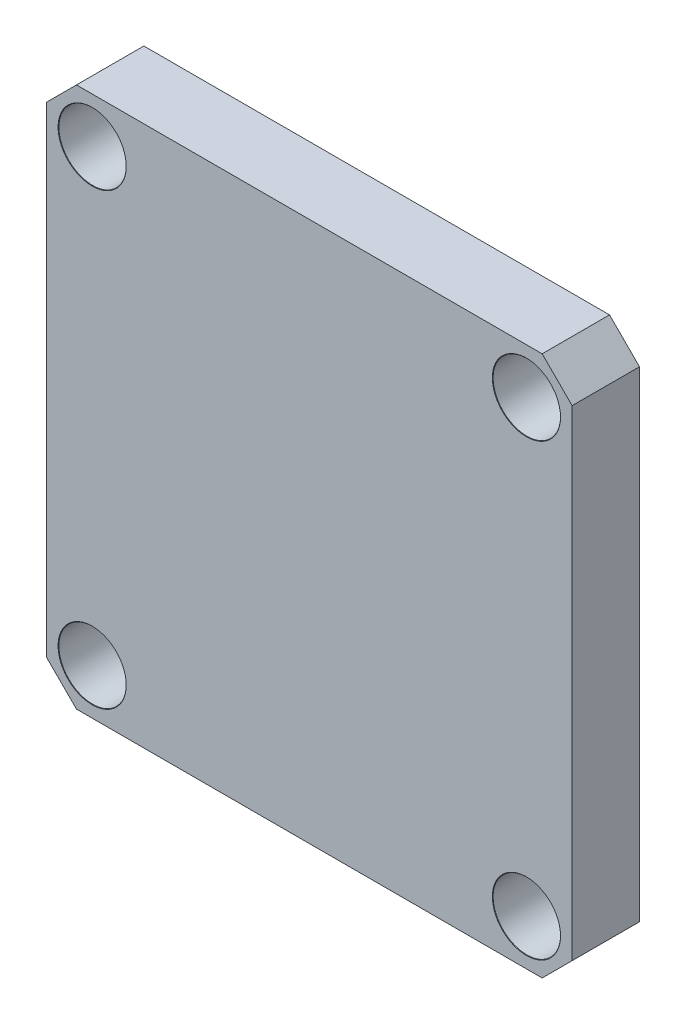
ISO-10303-21;
HEADER;
FILE_DESCRIPTION(('STEP AP214'),'2;1');
FILE_NAME('part.step','',(''),(''),'','','');
FILE_SCHEMA(('AUTOMOTIVE_DESIGN { 1 0 10303 214 1 1 1 1 }'));
ENDSEC;
DATA;
#1=APPLICATION_CONTEXT('core data for automotive mechanical design processes');
#2=APPLICATION_PROTOCOL_DEFINITION('international standard','automotive_design',2000,#1);
#3=PRODUCT_CONTEXT('',#1,'mechanical');
#4=PRODUCT('Part','Part','',(#3));
#5=PRODUCT_RELATED_PRODUCT_CATEGORY('part','',(#4));
#6=PRODUCT_DEFINITION_FORMATION('','',#4);
#7=PRODUCT_DEFINITION_CONTEXT('part definition',#1,'design');
#8=PRODUCT_DEFINITION('design','',#6,#7);
#9=PRODUCT_DEFINITION_SHAPE('','',#8);
#10=(LENGTH_UNIT() NAMED_UNIT(*) SI_UNIT(.MILLI.,.METRE.));
#11=(NAMED_UNIT(*) PLANE_ANGLE_UNIT() SI_UNIT($,.RADIAN.));
#12=(NAMED_UNIT(*) SI_UNIT($,.STERADIAN.) SOLID_ANGLE_UNIT());
#13=UNCERTAINTY_MEASURE_WITH_UNIT(LENGTH_MEASURE(1.E-05),#10,'distance_accuracy_value','');
#14=(GEOMETRIC_REPRESENTATION_CONTEXT(3) GLOBAL_UNCERTAINTY_ASSIGNED_CONTEXT((#13)) GLOBAL_UNIT_ASSIGNED_CONTEXT((#10,
#11,#12)) REPRESENTATION_CONTEXT('',''));
#15=CARTESIAN_POINT('',(0.,0.,0.));
#16=DIRECTION('',(0.,0.,1.));
#17=DIRECTION('',(1.,0.,0.));
#18=AXIS2_PLACEMENT_3D('',#15,#16,#17);
#19=CARTESIAN_POINT('',(17.5499999999998,-18.05,4.5));
#20=DIRECTION('',(-1.,0.,0.));
#21=DIRECTION('',(0.,0.,1.));
#22=AXIS2_PLACEMENT_3D('',#19,#20,#21);
#23=PLANE('',#22);
#24=DIRECTION('',(0.,1.,0.));
#25=VECTOR('',#24,1.);
#26=CARTESIAN_POINT('',(17.5499999999998,-18.05,4.5));
#27=LINE('',#26,#25);
#28=CARTESIAN_POINT('',(17.5499999999998,-16.05,4.5));
#29=VERTEX_POINT('',#28);
#30=CARTESIAN_POINT('',(17.5499999999998,16.05,4.5));
#31=VERTEX_POINT('',#30);
#32=EDGE_CURVE('E126',#29,#31,#27,.T.);
#33=ORIENTED_EDGE('',*,*,#32,.F.);
#34=DIRECTION('',(0.,0.,-1.));
#35=VECTOR('',#34,1.);
#36=CARTESIAN_POINT('',(17.5499999999998,-16.05,4.5));
#37=LINE('',#36,#35);
#38=CARTESIAN_POINT('',(17.55,-16.05,0.));
#39=VERTEX_POINT('',#38);
#40=EDGE_CURVE('E152',#29,#39,#37,.T.);
#41=ORIENTED_EDGE('',*,*,#40,.T.);
#42=DIRECTION('',(0.,1.,0.));
#43=VECTOR('',#42,1.);
#44=CARTESIAN_POINT('',(17.55,-18.05,0.));
#45=LINE('',#44,#43);
#46=CARTESIAN_POINT('',(17.55,16.05,0.));
#47=VERTEX_POINT('',#46);
#48=EDGE_CURVE('E158',#39,#47,#45,.T.);
#49=ORIENTED_EDGE('',*,*,#48,.T.);
#50=DIRECTION('',(0.,0.,1.));
#51=VECTOR('',#50,1.);
#52=CARTESIAN_POINT('',(17.5499999999998,16.05,4.5));
#53=LINE('',#52,#51);
#54=EDGE_CURVE('E150',#47,#31,#53,.T.);
#55=ORIENTED_EDGE('',*,*,#54,.T.);
#56=EDGE_LOOP('',(#33,#41,#49,#55));
#57=FACE_BOUND('',#56,.T.);
#58=ADVANCED_FACE('F34',(#57),#23,.F.);
#59=CARTESIAN_POINT('',(-17.5500000000001,18.05,4.5));
#60=DIRECTION('',(0.,-1.,0.));
#61=DIRECTION('',(0.,0.,-1.));
#62=AXIS2_PLACEMENT_3D('',#59,#60,#61);
#63=PLANE('',#62);
#64=DIRECTION('',(-1.,0.,0.));
#65=VECTOR('',#64,1.);
#66=CARTESIAN_POINT('',(-17.5500000000001,18.05,4.5));
#67=LINE('',#66,#65);
#68=CARTESIAN_POINT('',(15.5499999999998,18.05,4.5));
#69=VERTEX_POINT('',#68);
#70=CARTESIAN_POINT('',(-15.5500000000001,18.05,4.5));
#71=VERTEX_POINT('',#70);
#72=EDGE_CURVE('E129',#69,#71,#67,.T.);
#73=ORIENTED_EDGE('',*,*,#72,.F.);
#74=DIRECTION('',(0.,0.,-1.));
#75=VECTOR('',#74,1.);
#76=CARTESIAN_POINT('',(15.5499999999998,18.05,4.5));
#77=LINE('',#76,#75);
#78=CARTESIAN_POINT('',(15.55,18.05,0.));
#79=VERTEX_POINT('',#78);
#80=EDGE_CURVE('E11',#69,#79,#77,.T.);
#81=ORIENTED_EDGE('',*,*,#80,.T.);
#82=DIRECTION('',(-1.,0.,0.));
#83=VECTOR('',#82,1.);
#84=CARTESIAN_POINT('',(-17.55,18.05,0.));
#85=LINE('',#84,#83);
#86=CARTESIAN_POINT('',(-15.55,18.05,0.));
#87=VERTEX_POINT('',#86);
#88=EDGE_CURVE('E131',#79,#87,#85,.T.);
#89=ORIENTED_EDGE('',*,*,#88,.T.);
#90=DIRECTION('',(0.,0.,1.));
#91=VECTOR('',#90,1.);
#92=CARTESIAN_POINT('',(-15.5500000000001,18.05,4.5));
#93=LINE('',#92,#91);
#94=EDGE_CURVE('E42',#87,#71,#93,.T.);
#95=ORIENTED_EDGE('',*,*,#94,.T.);
#96=EDGE_LOOP('',(#73,#81,#89,#95));
#97=FACE_BOUND('',#96,.T.);
#98=ADVANCED_FACE('F224',(#97),#63,.F.);
#99=CARTESIAN_POINT('',(-17.5500000000001,-18.05,4.5));
#100=DIRECTION('',(1.,0.,0.));
#101=DIRECTION('',(0.,0.,-1.));
#102=AXIS2_PLACEMENT_3D('',#99,#100,#101);
#103=PLANE('',#102);
#104=DIRECTION('',(0.,-1.,0.));
#105=VECTOR('',#104,1.);
#106=CARTESIAN_POINT('',(-17.55,-18.05,0.));
#107=LINE('',#106,#105);
#108=CARTESIAN_POINT('',(-17.55,16.05,0.));
#109=VERTEX_POINT('',#108);
#110=CARTESIAN_POINT('',(-17.55,-16.05,0.));
#111=VERTEX_POINT('',#110);
#112=EDGE_CURVE('E127',#109,#111,#107,.T.);
#113=ORIENTED_EDGE('',*,*,#112,.T.);
#114=DIRECTION('',(0.,0.,1.));
#115=VECTOR('',#114,1.);
#116=CARTESIAN_POINT('',(-17.5500000000001,-16.05,4.5));
#117=LINE('',#116,#115);
#118=CARTESIAN_POINT('',(-17.5500000000001,-16.05,4.5));
#119=VERTEX_POINT('',#118);
#120=EDGE_CURVE('E105',#111,#119,#117,.T.);
#121=ORIENTED_EDGE('',*,*,#120,.T.);
#122=DIRECTION('',(0.,-1.,0.));
#123=VECTOR('',#122,1.);
#124=CARTESIAN_POINT('',(-17.5500000000001,-18.05,4.5));
#125=LINE('',#124,#123);
#126=CARTESIAN_POINT('',(-17.5500000000001,16.05,4.5));
#127=VERTEX_POINT('',#126);
#128=EDGE_CURVE('E170',#127,#119,#125,.T.);
#129=ORIENTED_EDGE('',*,*,#128,.F.);
#130=DIRECTION('',(0.,0.,-1.));
#131=VECTOR('',#130,1.);
#132=CARTESIAN_POINT('',(-17.5500000000001,16.05,4.5));
#133=LINE('',#132,#131);
#134=EDGE_CURVE('E110',#127,#109,#133,.T.);
#135=ORIENTED_EDGE('',*,*,#134,.T.);
#136=EDGE_LOOP('',(#113,#121,#129,#135));
#137=FACE_BOUND('',#136,.T.);
#138=ADVANCED_FACE('F222',(#137),#103,.F.);
#139=CARTESIAN_POINT('',(-17.5500000000001,-18.05,4.5));
#140=DIRECTION('',(0.,1.,0.));
#141=DIRECTION('',(0.,0.,1.));
#142=AXIS2_PLACEMENT_3D('',#139,#140,#141);
#143=PLANE('',#142);
#144=DIRECTION('',(1.,0.,0.));
#145=VECTOR('',#144,1.);
#146=CARTESIAN_POINT('',(-17.5500000000001,-18.05,4.5));
#147=LINE('',#146,#145);
#148=CARTESIAN_POINT('',(-15.5500000000001,-18.05,4.5));
#149=VERTEX_POINT('',#148);
#150=CARTESIAN_POINT('',(15.5499999999998,-18.05,4.5));
#151=VERTEX_POINT('',#150);
#152=EDGE_CURVE('E120',#149,#151,#147,.T.);
#153=ORIENTED_EDGE('',*,*,#152,.F.);
#154=DIRECTION('',(0.,0.,-1.));
#155=VECTOR('',#154,1.);
#156=CARTESIAN_POINT('',(-15.5500000000001,-18.05,4.5));
#157=LINE('',#156,#155);
#158=CARTESIAN_POINT('',(-15.55,-18.05,0.));
#159=VERTEX_POINT('',#158);
#160=EDGE_CURVE('E104',#149,#159,#157,.T.);
#161=ORIENTED_EDGE('',*,*,#160,.T.);
#162=DIRECTION('',(1.,0.,0.));
#163=VECTOR('',#162,1.);
#164=CARTESIAN_POINT('',(-17.55,-18.05,0.));
#165=LINE('',#164,#163);
#166=CARTESIAN_POINT('',(15.55,-18.05,0.));
#167=VERTEX_POINT('',#166);
#168=EDGE_CURVE('E117',#159,#167,#165,.T.);
#169=ORIENTED_EDGE('',*,*,#168,.T.);
#170=DIRECTION('',(0.,0.,1.));
#171=VECTOR('',#170,1.);
#172=CARTESIAN_POINT('',(15.5499999999998,-18.05,4.5));
#173=LINE('',#172,#171);
#174=EDGE_CURVE('E122',#167,#151,#173,.T.);
#175=ORIENTED_EDGE('',*,*,#174,.T.);
#176=EDGE_LOOP('',(#153,#161,#169,#175));
#177=FACE_BOUND('',#176,.T.);
#178=ADVANCED_FACE('F116',(#177),#143,.F.);
#179=CARTESIAN_POINT('',(-1.66533453693773E-13,0.,4.5));
#180=DIRECTION('',(0.,0.,-1.));
#181=DIRECTION('',(-1.,0.,0.));
#182=AXIS2_PLACEMENT_3D('',#179,#180,#181);
#183=PLANE('',#182);
#184=CARTESIAN_POINT('',(-14.5000000000001,15.,4.5));
#185=DIRECTION('',(0.,0.,1.));
#186=DIRECTION('',(1.,0.,0.));
#187=AXIS2_PLACEMENT_3D('',#184,#185,#186);
#188=CIRCLE('',#187,2.275);
#189=CARTESIAN_POINT('',(-12.2250000000001,15.,4.5));
#190=VERTEX_POINT('',#189);
#191=EDGE_CURVE('E203',#190,#190,#188,.T.);
#192=ORIENTED_EDGE('',*,*,#191,.F.);
#193=EDGE_LOOP('',(#192));
#194=FACE_BOUND('',#193,.T.);
#195=CARTESIAN_POINT('',(14.4999999999998,15.,4.5));
#196=DIRECTION('',(0.,0.,1.));
#197=DIRECTION('',(1.,0.,0.));
#198=AXIS2_PLACEMENT_3D('',#195,#196,#197);
#199=CIRCLE('',#198,2.275);
#200=CARTESIAN_POINT('',(16.7749999999998,15.,4.5));
#201=VERTEX_POINT('',#200);
#202=EDGE_CURVE('E194',#201,#201,#199,.T.);
#203=ORIENTED_EDGE('',*,*,#202,.F.);
#204=EDGE_LOOP('',(#203));
#205=FACE_BOUND('',#204,.T.);
#206=CARTESIAN_POINT('',(14.4999999999998,-15.,4.5));
#207=DIRECTION('',(0.,0.,1.));
#208=DIRECTION('',(1.,0.,0.));
#209=AXIS2_PLACEMENT_3D('',#206,#207,#208);
#210=CIRCLE('',#209,2.275);
#211=CARTESIAN_POINT('',(16.7749999999998,-15.,4.5));
#212=VERTEX_POINT('',#211);
#213=EDGE_CURVE('E185',#212,#212,#210,.T.);
#214=ORIENTED_EDGE('',*,*,#213,.F.);
#215=EDGE_LOOP('',(#214));
#216=FACE_BOUND('',#215,.T.);
#217=CARTESIAN_POINT('',(-14.5000000000001,-15.,4.5));
#218=DIRECTION('',(0.,0.,1.));
#219=DIRECTION('',(1.,0.,0.));
#220=AXIS2_PLACEMENT_3D('',#217,#218,#219);
#221=CIRCLE('',#220,2.275);
#222=CARTESIAN_POINT('',(-12.2250000000001,-15.,4.5));
#223=VERTEX_POINT('',#222);
#224=EDGE_CURVE('E176',#223,#223,#221,.T.);
#225=ORIENTED_EDGE('',*,*,#224,.F.);
#226=EDGE_LOOP('',(#225));
#227=FACE_BOUND('',#226,.T.);
#228=ORIENTED_EDGE('',*,*,#128,.T.);
#229=DIRECTION('',(-0.707106781186546,0.707106781186549,0.));
#230=VECTOR('',#229,1.);
#231=CARTESIAN_POINT('',(-15.5500000000001,-18.05,4.5));
#232=LINE('',#231,#230);
#233=EDGE_CURVE('E148',#119,#149,#232,.F.);
#234=ORIENTED_EDGE('',*,*,#233,.T.);
#235=ORIENTED_EDGE('',*,*,#152,.T.);
#236=DIRECTION('',(-0.707106781186549,-0.707106781186546,0.));
#237=VECTOR('',#236,1.);
#238=CARTESIAN_POINT('',(17.5499999999998,-16.05,4.5));
#239=LINE('',#238,#237);
#240=EDGE_CURVE('E146',#151,#29,#239,.F.);
#241=ORIENTED_EDGE('',*,*,#240,.T.);
#242=ORIENTED_EDGE('',*,*,#32,.T.);
#243=DIRECTION('',(0.707106781186546,-0.707106781186549,0.));
#244=VECTOR('',#243,1.);
#245=CARTESIAN_POINT('',(15.5499999999998,18.05,4.5));
#246=LINE('',#245,#244);
#247=EDGE_CURVE('E55',#31,#69,#246,.F.);
#248=ORIENTED_EDGE('',*,*,#247,.T.);
#249=ORIENTED_EDGE('',*,*,#72,.T.);
#250=DIRECTION('',(0.707106781186549,0.707106781186546,0.));
#251=VECTOR('',#250,1.);
#252=CARTESIAN_POINT('',(-17.5500000000001,16.05,4.5));
#253=LINE('',#252,#251);
#254=EDGE_CURVE('E143',#71,#127,#253,.F.);
#255=ORIENTED_EDGE('',*,*,#254,.T.);
#256=EDGE_LOOP('',(#228,#234,#235,#241,#242,#248,#249,#255));
#257=FACE_BOUND('',#256,.T.);
#258=ADVANCED_FACE('F209',(#194,#205,#216,#227,#257),#183,.F.);
#259=CARTESIAN_POINT('',(0.,0.,0.));
#260=DIRECTION('',(0.,0.,-1.));
#261=DIRECTION('',(-1.,0.,0.));
#262=AXIS2_PLACEMENT_3D('',#259,#260,#261);
#263=PLANE('',#262);
#264=CARTESIAN_POINT('',(-14.5,15.,0.));
#265=DIRECTION('',(0.,0.,1.));
#266=DIRECTION('',(1.,0.,0.));
#267=AXIS2_PLACEMENT_3D('',#264,#265,#266);
#268=CIRCLE('',#267,2.25);
#269=CARTESIAN_POINT('',(-12.25,15.,0.));
#270=VERTEX_POINT('',#269);
#271=EDGE_CURVE('E197',#270,#270,#268,.T.);
#272=ORIENTED_EDGE('',*,*,#271,.T.);
#273=EDGE_LOOP('',(#272));
#274=FACE_BOUND('',#273,.T.);
#275=CARTESIAN_POINT('',(14.5,15.,0.));
#276=DIRECTION('',(0.,0.,1.));
#277=DIRECTION('',(1.,0.,0.));
#278=AXIS2_PLACEMENT_3D('',#275,#276,#277);
#279=CIRCLE('',#278,2.25);
#280=CARTESIAN_POINT('',(16.75,15.,0.));
#281=VERTEX_POINT('',#280);
#282=EDGE_CURVE('E188',#281,#281,#279,.T.);
#283=ORIENTED_EDGE('',*,*,#282,.T.);
#284=EDGE_LOOP('',(#283));
#285=FACE_BOUND('',#284,.T.);
#286=CARTESIAN_POINT('',(14.5,-15.,0.));
#287=DIRECTION('',(0.,0.,1.));
#288=DIRECTION('',(1.,0.,0.));
#289=AXIS2_PLACEMENT_3D('',#286,#287,#288);
#290=CIRCLE('',#289,2.25);
#291=CARTESIAN_POINT('',(16.75,-15.,0.));
#292=VERTEX_POINT('',#291);
#293=EDGE_CURVE('E179',#292,#292,#290,.T.);
#294=ORIENTED_EDGE('',*,*,#293,.T.);
#295=EDGE_LOOP('',(#294));
#296=FACE_BOUND('',#295,.T.);
#297=CARTESIAN_POINT('',(-14.5,-15.,0.));
#298=DIRECTION('',(0.,0.,1.));
#299=DIRECTION('',(1.,0.,0.));
#300=AXIS2_PLACEMENT_3D('',#297,#298,#299);
#301=CIRCLE('',#300,2.25);
#302=CARTESIAN_POINT('',(-12.25,-15.,0.));
#303=VERTEX_POINT('',#302);
#304=EDGE_CURVE('E163',#303,#303,#301,.T.);
#305=ORIENTED_EDGE('',*,*,#304,.T.);
#306=EDGE_LOOP('',(#305));
#307=FACE_BOUND('',#306,.T.);
#308=ORIENTED_EDGE('',*,*,#168,.F.);
#309=DIRECTION('',(0.707106781186546,-0.707106781186549,0.));
#310=VECTOR('',#309,1.);
#311=CARTESIAN_POINT('',(-16.8,-16.8,0.));
#312=LINE('',#311,#310);
#313=EDGE_CURVE('E100',#159,#111,#312,.F.);
#314=ORIENTED_EDGE('',*,*,#313,.T.);
#315=ORIENTED_EDGE('',*,*,#112,.F.);
#316=DIRECTION('',(-0.707106781186549,-0.707106781186546,0.));
#317=VECTOR('',#316,1.);
#318=CARTESIAN_POINT('',(-16.8,16.8,0.));
#319=LINE('',#318,#317);
#320=EDGE_CURVE('E121',#109,#87,#319,.F.);
#321=ORIENTED_EDGE('',*,*,#320,.T.);
#322=ORIENTED_EDGE('',*,*,#88,.F.);
#323=DIRECTION('',(-0.707106781186546,0.707106781186549,0.));
#324=VECTOR('',#323,1.);
#325=CARTESIAN_POINT('',(16.8,16.8,0.));
#326=LINE('',#325,#324);
#327=EDGE_CURVE('E137',#79,#47,#326,.F.);
#328=ORIENTED_EDGE('',*,*,#327,.T.);
#329=ORIENTED_EDGE('',*,*,#48,.F.);
#330=DIRECTION('',(0.707106781186549,0.707106781186546,0.));
#331=VECTOR('',#330,1.);
#332=CARTESIAN_POINT('',(16.8,-16.8,0.));
#333=LINE('',#332,#331);
#334=EDGE_CURVE('E111',#39,#167,#333,.F.);
#335=ORIENTED_EDGE('',*,*,#334,.T.);
#336=EDGE_LOOP('',(#308,#314,#315,#321,#322,#328,#329,#335));
#337=FACE_BOUND('',#336,.T.);
#338=ADVANCED_FACE('F124',(#274,#285,#296,#307,#337),#263,.T.);
#339=CARTESIAN_POINT('',(-15.5500000000001,-18.05,4.5));
#340=DIRECTION('',(0.707106781186549,0.707106781186546,0.));
#341=DIRECTION('',(0.,0.,-1.));
#342=AXIS2_PLACEMENT_3D('',#339,#340,#341);
#343=PLANE('',#342);
#344=ORIENTED_EDGE('',*,*,#233,.F.);
#345=ORIENTED_EDGE('',*,*,#120,.F.);
#346=ORIENTED_EDGE('',*,*,#313,.F.);
#347=ORIENTED_EDGE('',*,*,#160,.F.);
#348=EDGE_LOOP('',(#344,#345,#346,#347));
#349=FACE_BOUND('',#348,.T.);
#350=ADVANCED_FACE('F103',(#349),#343,.F.);
#351=CARTESIAN_POINT('',(17.5499999999998,-16.05,4.5));
#352=DIRECTION('',(-0.707106781186546,0.707106781186549,0.));
#353=DIRECTION('',(0.,0.,-1.));
#354=AXIS2_PLACEMENT_3D('',#351,#352,#353);
#355=PLANE('',#354);
#356=ORIENTED_EDGE('',*,*,#240,.F.);
#357=ORIENTED_EDGE('',*,*,#174,.F.);
#358=ORIENTED_EDGE('',*,*,#334,.F.);
#359=ORIENTED_EDGE('',*,*,#40,.F.);
#360=EDGE_LOOP('',(#356,#357,#358,#359));
#361=FACE_BOUND('',#360,.T.);
#362=ADVANCED_FACE('F228',(#361),#355,.F.);
#363=CARTESIAN_POINT('',(15.5499999999998,18.05,4.5));
#364=DIRECTION('',(-0.707106781186549,-0.707106781186546,0.));
#365=DIRECTION('',(0.,0.,-1.));
#366=AXIS2_PLACEMENT_3D('',#363,#364,#365);
#367=PLANE('',#366);
#368=ORIENTED_EDGE('',*,*,#247,.F.);
#369=ORIENTED_EDGE('',*,*,#54,.F.);
#370=ORIENTED_EDGE('',*,*,#327,.F.);
#371=ORIENTED_EDGE('',*,*,#80,.F.);
#372=EDGE_LOOP('',(#368,#369,#370,#371));
#373=FACE_BOUND('',#372,.T.);
#374=ADVANCED_FACE('F227',(#373),#367,.F.);
#375=CARTESIAN_POINT('',(-17.5500000000001,16.05,4.5));
#376=DIRECTION('',(0.707106781186546,-0.707106781186549,0.));
#377=DIRECTION('',(0.,0.,-1.));
#378=AXIS2_PLACEMENT_3D('',#375,#376,#377);
#379=PLANE('',#378);
#380=ORIENTED_EDGE('',*,*,#254,.F.);
#381=ORIENTED_EDGE('',*,*,#94,.F.);
#382=ORIENTED_EDGE('',*,*,#320,.F.);
#383=ORIENTED_EDGE('',*,*,#134,.F.);
#384=EDGE_LOOP('',(#380,#381,#382,#383));
#385=FACE_BOUND('',#384,.T.);
#386=ADVANCED_FACE('F36',(#385),#379,.F.);
#387=CARTESIAN_POINT('',(-14.5000000000001,-15.,4.5));
#388=DIRECTION('',(0.,0.,1.));
#389=DIRECTION('',(1.,0.,0.));
#390=AXIS2_PLACEMENT_3D('',#387,#388,#389);
#391=CYLINDRICAL_SURFACE('',#390,2.24999999999999);
#392=ORIENTED_EDGE('',*,*,#304,.F.);
#393=EDGE_LOOP('',(#392));
#394=FACE_BOUND('',#393,.T.);
#395=CARTESIAN_POINT('',(-14.5000000000001,-15.,4.47500000000001));
#396=DIRECTION('',(0.,0.,1.));
#397=DIRECTION('',(1.,0.,0.));
#398=AXIS2_PLACEMENT_3D('',#395,#396,#397);
#399=CIRCLE('',#398,2.24999999999999);
#400=CARTESIAN_POINT('',(-12.2500000000001,-15.,4.47500000000001));
#401=VERTEX_POINT('',#400);
#402=EDGE_CURVE('E166',#401,#401,#399,.T.);
#403=ORIENTED_EDGE('',*,*,#402,.T.);
#404=EDGE_LOOP('',(#403));
#405=FACE_BOUND('',#404,.T.);
#406=ADVANCED_FACE('F250',(#394,#405),#391,.F.);
#407=CARTESIAN_POINT('',(-14.5000000000001,-15.,4.5));
#408=DIRECTION('',(0.,0.,1.));
#409=DIRECTION('',(1.,0.,0.));
#410=AXIS2_PLACEMENT_3D('',#407,#408,#409);
#411=CONICAL_SURFACE('',#410,2.275,0.785398163397726);
#412=ORIENTED_EDGE('',*,*,#402,.F.);
#413=EDGE_LOOP('',(#412));
#414=FACE_BOUND('',#413,.T.);
#415=ORIENTED_EDGE('',*,*,#224,.T.);
#416=EDGE_LOOP('',(#415));
#417=FACE_BOUND('',#416,.T.);
#418=ADVANCED_FACE('F253',(#414,#417),#411,.F.);
#419=CARTESIAN_POINT('',(14.4999999999998,-15.,4.5));
#420=DIRECTION('',(0.,0.,1.));
#421=DIRECTION('',(1.,0.,0.));
#422=AXIS2_PLACEMENT_3D('',#419,#420,#421);
#423=CYLINDRICAL_SURFACE('',#422,2.24999999999999);
#424=ORIENTED_EDGE('',*,*,#293,.F.);
#425=EDGE_LOOP('',(#424));
#426=FACE_BOUND('',#425,.T.);
#427=CARTESIAN_POINT('',(14.4999999999998,-15.,4.47500000000001));
#428=DIRECTION('',(0.,0.,1.));
#429=DIRECTION('',(1.,0.,0.));
#430=AXIS2_PLACEMENT_3D('',#427,#428,#429);
#431=CIRCLE('',#430,2.24999999999999);
#432=CARTESIAN_POINT('',(16.7499999999998,-15.,4.47500000000001));
#433=VERTEX_POINT('',#432);
#434=EDGE_CURVE('E182',#433,#433,#431,.T.);
#435=ORIENTED_EDGE('',*,*,#434,.T.);
#436=EDGE_LOOP('',(#435));
#437=FACE_BOUND('',#436,.T.);
#438=ADVANCED_FACE('F257',(#426,#437),#423,.F.);
#439=CARTESIAN_POINT('',(14.4999999999998,-15.,4.5));
#440=DIRECTION('',(0.,0.,1.));
#441=DIRECTION('',(1.,0.,0.));
#442=AXIS2_PLACEMENT_3D('',#439,#440,#441);
#443=CONICAL_SURFACE('',#442,2.275,0.785398163397691);
#444=ORIENTED_EDGE('',*,*,#434,.F.);
#445=EDGE_LOOP('',(#444));
#446=FACE_BOUND('',#445,.T.);
#447=ORIENTED_EDGE('',*,*,#213,.T.);
#448=EDGE_LOOP('',(#447));
#449=FACE_BOUND('',#448,.T.);
#450=ADVANCED_FACE('F261',(#446,#449),#443,.F.);
#451=CARTESIAN_POINT('',(14.4999999999998,15.,4.5));
#452=DIRECTION('',(0.,0.,1.));
#453=DIRECTION('',(1.,0.,0.));
#454=AXIS2_PLACEMENT_3D('',#451,#452,#453);
#455=CYLINDRICAL_SURFACE('',#454,2.24999999999999);
#456=ORIENTED_EDGE('',*,*,#282,.F.);
#457=EDGE_LOOP('',(#456));
#458=FACE_BOUND('',#457,.T.);
#459=CARTESIAN_POINT('',(14.4999999999998,15.,4.47500000000001));
#460=DIRECTION('',(0.,0.,1.));
#461=DIRECTION('',(1.,0.,0.));
#462=AXIS2_PLACEMENT_3D('',#459,#460,#461);
#463=CIRCLE('',#462,2.24999999999999);
#464=CARTESIAN_POINT('',(16.7499999999998,15.,4.47500000000001));
#465=VERTEX_POINT('',#464);
#466=EDGE_CURVE('E191',#465,#465,#463,.T.);
#467=ORIENTED_EDGE('',*,*,#466,.T.);
#468=EDGE_LOOP('',(#467));
#469=FACE_BOUND('',#468,.T.);
#470=ADVANCED_FACE('F265',(#458,#469),#455,.F.);
#471=CARTESIAN_POINT('',(14.4999999999998,15.,4.5));
#472=DIRECTION('',(0.,0.,1.));
#473=DIRECTION('',(1.,0.,0.));
#474=AXIS2_PLACEMENT_3D('',#471,#472,#473);
#475=CONICAL_SURFACE('',#474,2.275,0.785398163397691);
#476=ORIENTED_EDGE('',*,*,#466,.F.);
#477=EDGE_LOOP('',(#476));
#478=FACE_BOUND('',#477,.T.);
#479=ORIENTED_EDGE('',*,*,#202,.T.);
#480=EDGE_LOOP('',(#479));
#481=FACE_BOUND('',#480,.T.);
#482=ADVANCED_FACE('F269',(#478,#481),#475,.F.);
#483=CARTESIAN_POINT('',(-14.5000000000001,15.,4.5));
#484=DIRECTION('',(0.,0.,1.));
#485=DIRECTION('',(1.,0.,0.));
#486=AXIS2_PLACEMENT_3D('',#483,#484,#485);
#487=CYLINDRICAL_SURFACE('',#486,2.24999999999999);
#488=ORIENTED_EDGE('',*,*,#271,.F.);
#489=EDGE_LOOP('',(#488));
#490=FACE_BOUND('',#489,.T.);
#491=CARTESIAN_POINT('',(-14.5000000000001,15.,4.47500000000001));
#492=DIRECTION('',(0.,0.,1.));
#493=DIRECTION('',(1.,0.,0.));
#494=AXIS2_PLACEMENT_3D('',#491,#492,#493);
#495=CIRCLE('',#494,2.24999999999999);
#496=CARTESIAN_POINT('',(-12.2500000000001,15.,4.47500000000001));
#497=VERTEX_POINT('',#496);
#498=EDGE_CURVE('E200',#497,#497,#495,.T.);
#499=ORIENTED_EDGE('',*,*,#498,.T.);
#500=EDGE_LOOP('',(#499));
#501=FACE_BOUND('',#500,.T.);
#502=ADVANCED_FACE('F273',(#490,#501),#487,.F.);
#503=CARTESIAN_POINT('',(-14.5000000000001,15.,4.5));
#504=DIRECTION('',(0.,0.,1.));
#505=DIRECTION('',(1.,0.,0.));
#506=AXIS2_PLACEMENT_3D('',#503,#504,#505);
#507=CONICAL_SURFACE('',#506,2.275,0.785398163397726);
#508=ORIENTED_EDGE('',*,*,#498,.F.);
#509=EDGE_LOOP('',(#508));
#510=FACE_BOUND('',#509,.T.);
#511=ORIENTED_EDGE('',*,*,#191,.T.);
#512=EDGE_LOOP('',(#511));
#513=FACE_BOUND('',#512,.T.);
#514=ADVANCED_FACE('F207',(#510,#513),#507,.F.);
#515=CLOSED_SHELL('',(#58,#98,#138,#178,#258,#338,#350,#362,#374,#386,#406,#418,#438,#450,#470,
#482,#502,#514));
#516=MANIFOLD_SOLID_BREP('B2',#515);
#517=ADVANCED_BREP_SHAPE_REPRESENTATION('',(#18,#516),#14);
#518=SHAPE_DEFINITION_REPRESENTATION(#9,#517);
ENDSEC;
END-ISO-10303-21;
